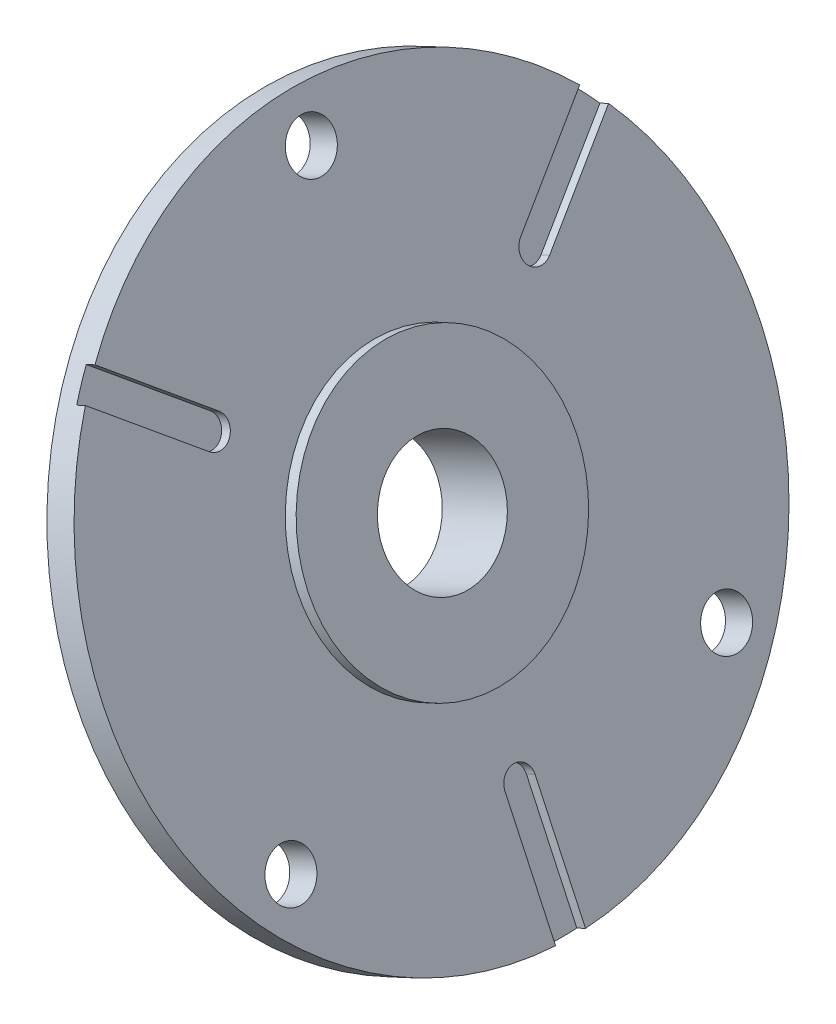
ISO-10303-21;
HEADER;
FILE_DESCRIPTION(('STEP AP214'),'2;1');
FILE_NAME('part.step','',(''),(''),'','','');
FILE_SCHEMA(('AUTOMOTIVE_DESIGN { 1 0 10303 214 1 1 1 1 }'));
ENDSEC;
DATA;
#1=APPLICATION_CONTEXT('core data for automotive mechanical design processes');
#2=APPLICATION_PROTOCOL_DEFINITION('international standard','automotive_design',2000,#1);
#3=PRODUCT_CONTEXT('',#1,'mechanical');
#4=PRODUCT('Part','Part','',(#3));
#5=PRODUCT_RELATED_PRODUCT_CATEGORY('part','',(#4));
#6=PRODUCT_DEFINITION_FORMATION('','',#4);
#7=PRODUCT_DEFINITION_CONTEXT('part definition',#1,'design');
#8=PRODUCT_DEFINITION('design','',#6,#7);
#9=PRODUCT_DEFINITION_SHAPE('','',#8);
#10=(LENGTH_UNIT() NAMED_UNIT(*) SI_UNIT(.MILLI.,.METRE.));
#11=(NAMED_UNIT(*) PLANE_ANGLE_UNIT() SI_UNIT($,.RADIAN.));
#12=(NAMED_UNIT(*) SI_UNIT($,.STERADIAN.) SOLID_ANGLE_UNIT());
#13=UNCERTAINTY_MEASURE_WITH_UNIT(LENGTH_MEASURE(1.E-05),#10,'distance_accuracy_value','');
#14=(GEOMETRIC_REPRESENTATION_CONTEXT(3) GLOBAL_UNCERTAINTY_ASSIGNED_CONTEXT((#13)) GLOBAL_UNIT_ASSIGNED_CONTEXT((#10,
#11,#12)) REPRESENTATION_CONTEXT('',''));
#15=CARTESIAN_POINT('',(0.,0.,0.));
#16=DIRECTION('',(0.,0.,1.));
#17=DIRECTION('',(1.,0.,0.));
#18=AXIS2_PLACEMENT_3D('',#15,#16,#17);
#19=CARTESIAN_POINT('',(0.488501018785264,0.227791766078759,0.));
#20=DIRECTION('',(0.906307787036649,0.422618261740701,0.));
#21=DIRECTION('',(-0.422618261740701,0.906307787036649,0.));
#22=AXIS2_PLACEMENT_3D('',#19,#20,#21);
#23=CYLINDRICAL_SURFACE('',#22,55.);
#24=CARTESIAN_POINT('',(-112.382165592545,-52.4046644558447,0.));
#25=DIRECTION('',(0.906307787036649,0.422618261740701,0.));
#26=DIRECTION('',(-0.422618261740701,0.906307787036649,0.));
#27=AXIS2_PLACEMENT_3D('',#24,#25,#26);
#28=CIRCLE('',#27,55.);
#29=CARTESIAN_POINT('',(-135.626169988284,-2.55773616882898,0.));
#30=VERTEX_POINT('',#29);
#31=EDGE_CURVE('E219',#30,#30,#28,.T.);
#32=ORIENTED_EDGE('',*,*,#31,.T.);
#33=EDGE_LOOP('',(#32));
#34=FACE_BOUND('',#33,.T.);
#35=CARTESIAN_POINT('',(-109.300719116621,-50.9677623659263,0.));
#36=DIRECTION('',(0.906307787036649,0.422618261740701,0.));
#37=DIRECTION('',(-0.422618261740701,0.906307787036649,0.));
#38=AXIS2_PLACEMENT_3D('',#35,#36,#37);
#39=CIRCLE('',#38,55.);
#40=CARTESIAN_POINT('',(-123.416873359484,-20.6955719011254,43.695865638004));
#41=VERTEX_POINT('',#40);
#42=CARTESIAN_POINT('',(-125.03559521432,-17.2242116810508,40.4819275895714));
#43=VERTEX_POINT('',#42);
#44=EDGE_CURVE('E11',#41,#43,#39,.F.);
#45=ORIENTED_EDGE('',*,*,#44,.T.);
#46=DIRECTION('',(0.906307787036649,0.422618261740701,0.));
#47=VECTOR('',#46,1.);
#48=CARTESIAN_POINT('',(-15.2463750789136,33.9713424509542,40.4819275895714));
#49=LINE('',#48,#47);
#50=CARTESIAN_POINT('',(-123.585502755061,-16.5480224622657,40.4819275895714));
#51=VERTEX_POINT('',#50);
#52=EDGE_CURVE('E191',#43,#51,#49,.T.);
#53=ORIENTED_EDGE('',*,*,#52,.T.);
#54=CARTESIAN_POINT('',(-107.850626657362,-50.2915731471412,0.));
#55=DIRECTION('',(0.906307787036649,0.422618261740701,0.));
#56=DIRECTION('',(-0.422618261740701,0.906307787036649,0.));
#57=AXIS2_PLACEMENT_3D('',#54,#55,#56);
#58=CIRCLE('',#57,55.);
#59=CARTESIAN_POINT('',(-123.585502755061,-16.5480224622657,-40.4819275895714));
#60=VERTEX_POINT('',#59);
#61=EDGE_CURVE('E214',#60,#51,#58,.T.);
#62=ORIENTED_EDGE('',*,*,#61,.F.);
#63=DIRECTION('',(0.906307787036649,0.422618261740701,0.));
#64=VECTOR('',#63,1.);
#65=CARTESIAN_POINT('',(-15.2463750789136,33.9713424509542,-40.4819275895714));
#66=LINE('',#65,#64);
#67=CARTESIAN_POINT('',(-125.03559521432,-17.2242116810508,-40.4819275895714));
#68=VERTEX_POINT('',#67);
#69=EDGE_CURVE('E187',#68,#60,#66,.T.);
#70=ORIENTED_EDGE('',*,*,#69,.F.);
#71=CARTESIAN_POINT('',(-109.300719116621,-50.9677623659263,0.));
#72=DIRECTION('',(0.906307787036649,0.422618261740701,0.));
#73=DIRECTION('',(-0.422618261740701,0.906307787036649,0.));
#74=AXIS2_PLACEMENT_3D('',#71,#72,#73);
#75=CIRCLE('',#74,55.);
#76=CARTESIAN_POINT('',(-123.416873359484,-20.6955719011253,-43.695865638004));
#77=VERTEX_POINT('',#76);
#78=EDGE_CURVE('E41',#68,#77,#75,.F.);
#79=ORIENTED_EDGE('',*,*,#78,.T.);
#80=DIRECTION('',(0.906307787036649,0.422618261740701,0.));
#81=VECTOR('',#80,1.);
#82=CARTESIAN_POINT('',(-13.6276532240782,30.4999822308798,-43.695865638004));
#83=LINE('',#82,#81);
#84=CARTESIAN_POINT('',(-121.966780900226,-20.0193826823402,-43.695865638004));
#85=VERTEX_POINT('',#84);
#86=EDGE_CURVE('E184',#77,#85,#83,.T.);
#87=ORIENTED_EDGE('',*,*,#86,.T.);
#88=CARTESIAN_POINT('',(-84.6306470787884,-100.086980047483,-2.50000000000001));
#89=VERTEX_POINT('',#88);
#90=EDGE_CURVE('E217',#89,#85,#58,.T.);
#91=ORIENTED_EDGE('',*,*,#90,.F.);
#92=DIRECTION('',(0.906307787036649,0.422618261740701,0.));
#93=VECTOR('',#92,1.);
#94=CARTESIAN_POINT('',(23.708480597359,-49.5676151342631,-2.50000000000001));
#95=LINE('',#94,#93);
#96=CARTESIAN_POINT('',(-86.0807395380471,-100.763169266268,-2.50000000000001));
#97=VERTEX_POINT('',#96);
#98=EDGE_CURVE('E56',#97,#89,#95,.T.);
#99=ORIENTED_EDGE('',*,*,#98,.F.);
#100=CARTESIAN_POINT('',(-109.300719116621,-50.9677623659263,0.));
#101=DIRECTION('',(0.906307787036649,0.422618261740701,0.));
#102=DIRECTION('',(-0.422618261740701,0.906307787036649,0.));
#103=AXIS2_PLACEMENT_3D('',#100,#101,#102);
#104=CIRCLE('',#103,55.);
#105=CARTESIAN_POINT('',(-86.0807395380471,-100.763169266268,2.49999999999999));
#106=VERTEX_POINT('',#105);
#107=EDGE_CURVE('E252',#97,#106,#104,.F.);
#108=ORIENTED_EDGE('',*,*,#107,.T.);
#109=DIRECTION('',(0.906307787036649,0.422618261740701,0.));
#110=VECTOR('',#109,1.);
#111=CARTESIAN_POINT('',(23.708480597359,-49.5676151342631,2.49999999999999));
#112=LINE('',#111,#110);
#113=CARTESIAN_POINT('',(-84.6306470787884,-100.086980047483,2.49999999999999));
#114=VERTEX_POINT('',#113);
#115=EDGE_CURVE('E181',#106,#114,#112,.T.);
#116=ORIENTED_EDGE('',*,*,#115,.T.);
#117=CARTESIAN_POINT('',(-121.966780900226,-20.0193826823402,43.695865638004));
#118=VERTEX_POINT('',#117);
#119=EDGE_CURVE('E218',#118,#114,#58,.T.);
#120=ORIENTED_EDGE('',*,*,#119,.F.);
#121=DIRECTION('',(0.906307787036649,0.422618261740701,0.));
#122=VECTOR('',#121,1.);
#123=CARTESIAN_POINT('',(-13.6276532240782,30.4999822308797,43.695865638004));
#124=LINE('',#123,#122);
#125=EDGE_CURVE('E189',#41,#118,#124,.T.);
#126=ORIENTED_EDGE('',*,*,#125,.F.);
#127=EDGE_LOOP('',(#45,#53,#62,#70,#79,#87,#91,#99,#108,#116,#120,#126));
#128=FACE_BOUND('',#127,.T.);
#129=ADVANCED_FACE('F33',(#34,#128),#23,.T.);
#130=CARTESIAN_POINT('',(-131.094631053101,-0.444644860125507,0.));
#131=DIRECTION('',(0.906307787036649,0.422618261740701,0.));
#132=DIRECTION('',(-0.422618261740701,0.906307787036649,0.));
#133=AXIS2_PLACEMENT_3D('',#130,#131,#132);
#134=PLANE('',#133);
#135=CARTESIAN_POINT('',(-94.9470719993373,-77.9633354104488,-36.3871110481513));
#136=DIRECTION('',(0.906307787036649,0.422618261740701,0.));
#137=DIRECTION('',(-0.422618261740701,0.906307787036649,0.));
#138=AXIS2_PLACEMENT_3D('',#135,#136,#137);
#139=CIRCLE('',#138,4.);
#140=CARTESIAN_POINT('',(-96.6375450463001,-74.3381042623022,-36.3871110481513));
#141=VERTEX_POINT('',#140);
#142=EDGE_CURVE('E208',#141,#141,#139,.T.);
#143=ORIENTED_EDGE('',*,*,#142,.F.);
#144=EDGE_LOOP('',(#143));
#145=FACE_BOUND('',#144,.T.);
#146=CARTESIAN_POINT('',(-94.9470719993373,-77.9633354104488,36.3871110481513));
#147=DIRECTION('',(0.906307787036649,0.422618261740701,0.));
#148=DIRECTION('',(-0.422618261740701,0.906307787036649,0.));
#149=AXIS2_PLACEMENT_3D('',#146,#147,#148);
#150=CIRCLE('',#149,4.);
#151=CARTESIAN_POINT('',(-96.6375450463001,-74.3381042623022,36.3871110481513));
#152=VERTEX_POINT('',#151);
#153=EDGE_CURVE('E234',#152,#152,#150,.T.);
#154=ORIENTED_EDGE('',*,*,#153,.F.);
#155=EDGE_LOOP('',(#154));
#156=FACE_BOUND('',#155,.T.);
#157=CARTESIAN_POINT('',(-127.924994090045,-7.24195326290257,0.));
#158=DIRECTION('',(0.906307787036649,0.422618261740701,0.));
#159=DIRECTION('',(-0.422618261740701,0.906307787036649,0.));
#160=AXIS2_PLACEMENT_3D('',#157,#158,#159);
#161=CIRCLE('',#160,4.);
#162=CARTESIAN_POINT('',(-129.615467137007,-3.61672211475597,0.));
#163=VERTEX_POINT('',#162);
#164=EDGE_CURVE('E203',#163,#163,#161,.T.);
#165=ORIENTED_EDGE('',*,*,#164,.F.);
#166=EDGE_LOOP('',(#165));
#167=FACE_BOUND('',#166,.T.);
#168=CARTESIAN_POINT('',(-107.850626657362,-50.2915731471412,0.));
#169=DIRECTION('',(0.906307787036649,0.422618261740701,0.));
#170=DIRECTION('',(-0.422618261740701,0.906307787036649,0.));
#171=AXIS2_PLACEMENT_3D('',#168,#169,#170);
#172=CIRCLE('',#171,22.5);
#173=CARTESIAN_POINT('',(-117.359537546528,-29.8996479388166,0.));
#174=VERTEX_POINT('',#173);
#175=EDGE_CURVE('E211',#174,#174,#172,.T.);
#176=ORIENTED_EDGE('',*,*,#175,.F.);
#177=EDGE_LOOP('',(#176));
#178=FACE_BOUND('',#177,.T.);
#179=ORIENTED_EDGE('',*,*,#61,.T.);
#180=DIRECTION('',(0.271653782274187,-0.582563416069588,-0.766044443118975));
#181=VECTOR('',#180,1.);
#182=CARTESIAN_POINT('',(-118.263850280148,-27.9603430232644,25.4752441836206));
#183=LINE('',#182,#181);
#184=CARTESIAN_POINT('',(-118.167869964376,-28.1661734746697,25.204586484949));
#185=VERTEX_POINT('',#184);
#186=EDGE_CURVE('E249',#51,#185,#183,.T.);
#187=ORIENTED_EDGE('',*,*,#186,.T.);
#188=CARTESIAN_POINT('',(-117.358509036958,-29.9018535847069,26.8115555091653));
#189=DIRECTION('',(0.906307787036649,0.422618261740701,0.));
#190=DIRECTION('',(-0.422618261740701,0.906307787036649,0.));
#191=AXIS2_PLACEMENT_3D('',#188,#189,#190);
#192=CIRCLE('',#191,2.5);
#193=CARTESIAN_POINT('',(-116.54914810954,-31.6375336947441,28.4185245333817));
#194=VERTEX_POINT('',#193);
#195=EDGE_CURVE('E150',#194,#185,#192,.T.);
#196=ORIENTED_EDGE('',*,*,#195,.F.);
#197=DIRECTION('',(0.271653782274187,-0.582563416069588,-0.766044443118975));
#198=VECTOR('',#197,1.);
#199=CARTESIAN_POINT('',(-116.645128425312,-31.4317032433389,28.6891822320533));
#200=LINE('',#199,#198);
#201=EDGE_CURVE('E139',#118,#194,#200,.T.);
#202=ORIENTED_EDGE('',*,*,#201,.F.);
#203=ORIENTED_EDGE('',*,*,#119,.T.);
#204=DIRECTION('',(-0.422618261740701,0.906307787036649,0.));
#205=VECTOR('',#204,1.);
#206=CARTESIAN_POINT('',(-131.094631053101,-0.444644860125507,2.50000000000002));
#207=LINE('',#206,#205);
#208=CARTESIAN_POINT('',(-93.0589874964377,-82.0123456934239,2.5));
#209=VERTEX_POINT('',#208);
#210=EDGE_CURVE('E240',#114,#209,#207,.T.);
#211=ORIENTED_EDGE('',*,*,#210,.T.);
#212=CARTESIAN_POINT('',(-93.0589874964377,-82.0123456934239,0.));
#213=DIRECTION('',(0.906307787036649,0.422618261740701,0.));
#214=DIRECTION('',(-0.422618261740701,0.906307787036649,0.));
#215=AXIS2_PLACEMENT_3D('',#212,#213,#214);
#216=CIRCLE('',#215,2.5);
#217=CARTESIAN_POINT('',(-93.0589874964377,-82.0123456934239,-2.5));
#218=VERTEX_POINT('',#217);
#219=EDGE_CURVE('E169',#218,#209,#216,.T.);
#220=ORIENTED_EDGE('',*,*,#219,.F.);
#221=DIRECTION('',(-0.422618261740701,0.906307787036649,0.));
#222=VECTOR('',#221,1.);
#223=CARTESIAN_POINT('',(-131.094631053101,-0.444644860125506,-2.49999999999998));
#224=LINE('',#223,#222);
#225=EDGE_CURVE('E231',#89,#218,#224,.T.);
#226=ORIENTED_EDGE('',*,*,#225,.F.);
#227=ORIENTED_EDGE('',*,*,#90,.T.);
#228=DIRECTION('',(0.271653782274187,-0.582563416069588,0.766044443118975));
#229=VECTOR('',#228,1.);
#230=CARTESIAN_POINT('',(-116.645128425312,-31.4317032433388,-28.6891822320533));
#231=LINE('',#230,#229);
#232=CARTESIAN_POINT('',(-116.54914810954,-31.6375336947441,-28.4185245333817));
#233=VERTEX_POINT('',#232);
#234=EDGE_CURVE('E243',#85,#233,#231,.T.);
#235=ORIENTED_EDGE('',*,*,#234,.T.);
#236=CARTESIAN_POINT('',(-117.358509036958,-29.9018535847069,-26.8115555091653));
#237=DIRECTION('',(0.906307787036649,0.422618261740701,0.));
#238=DIRECTION('',(-0.422618261740701,0.906307787036649,0.));
#239=AXIS2_PLACEMENT_3D('',#236,#237,#238);
#240=CIRCLE('',#239,2.49999999999999);
#241=CARTESIAN_POINT('',(-118.167869964376,-28.1661734746697,-25.2045864849489));
#242=VERTEX_POINT('',#241);
#243=EDGE_CURVE('E157',#242,#233,#240,.T.);
#244=ORIENTED_EDGE('',*,*,#243,.F.);
#245=DIRECTION('',(0.271653782274187,-0.582563416069589,0.766044443118975));
#246=VECTOR('',#245,1.);
#247=CARTESIAN_POINT('',(-118.263850280148,-27.9603430232644,-25.4752441836206));
#248=LINE('',#247,#246);
#249=EDGE_CURVE('E246',#60,#242,#248,.T.);
#250=ORIENTED_EDGE('',*,*,#249,.F.);
#251=EDGE_LOOP('',(#179,#187,#196,#202,#203,#211,#220,#226,#227,#235,#244,#250));
#252=FACE_BOUND('',#251,.T.);
#253=ADVANCED_FACE('F273',(#145,#156,#167,#178,#252),#134,.T.);
#254=CARTESIAN_POINT('',(0.488501018785264,0.227791766078759,0.));
#255=DIRECTION('',(0.906307787036649,0.422618261740701,0.));
#256=DIRECTION('',(-0.422618261740701,0.906307787036649,0.));
#257=AXIS2_PLACEMENT_3D('',#254,#255,#256);
#258=CYLINDRICAL_SURFACE('',#257,9.99999999999757);
#259=CARTESIAN_POINT('',(-106.038011083289,-49.4463366236598,0.));
#260=DIRECTION('',(0.906307787036649,0.422618261740701,0.));
#261=DIRECTION('',(-0.422618261740701,0.906307787036649,0.));
#262=AXIS2_PLACEMENT_3D('',#259,#260,#261);
#263=CIRCLE('',#262,9.99999999999757);
#264=CARTESIAN_POINT('',(-110.264193700695,-40.3832587532955,0.));
#265=VERTEX_POINT('',#264);
#266=EDGE_CURVE('E204',#265,#265,#263,.T.);
#267=ORIENTED_EDGE('',*,*,#266,.T.);
#268=EDGE_LOOP('',(#267));
#269=FACE_BOUND('',#268,.T.);
#270=CARTESIAN_POINT('',(-116.913704527729,-54.5177557645483,0.));
#271=DIRECTION('',(0.906307787036649,0.422618261740701,0.));
#272=DIRECTION('',(-0.422618261740701,0.906307787036649,0.));
#273=AXIS2_PLACEMENT_3D('',#270,#271,#272);
#274=CIRCLE('',#273,9.99999999999757);
#275=CARTESIAN_POINT('',(-121.139887145135,-45.454677894184,0.));
#276=VERTEX_POINT('',#275);
#277=EDGE_CURVE('E228',#276,#276,#274,.T.);
#278=ORIENTED_EDGE('',*,*,#277,.F.);
#279=EDGE_LOOP('',(#278));
#280=FACE_BOUND('',#279,.T.);
#281=ADVANCED_FACE('F35',(#269,#280),#258,.F.);
#282=CARTESIAN_POINT('',(-121.139887145135,-45.454677894184,0.));
#283=DIRECTION('',(-0.906307787036649,-0.422618261740701,0.));
#284=DIRECTION('',(0.422618261740701,-0.906307787036649,0.));
#285=AXIS2_PLACEMENT_3D('',#282,#283,#284);
#286=PLANE('',#285);
#287=ORIENTED_EDGE('',*,*,#277,.T.);
#288=EDGE_LOOP('',(#287));
#289=FACE_BOUND('',#288,.T.);
#290=CARTESIAN_POINT('',(-116.913704527729,-54.5177557645482,0.));
#291=DIRECTION('',(0.906307787036649,0.422618261740701,0.));
#292=DIRECTION('',(-0.422618261740701,0.906307787036649,0.));
#293=AXIS2_PLACEMENT_3D('',#290,#291,#292);
#294=CIRCLE('',#293,14.9999999999976);
#295=CARTESIAN_POINT('',(-123.252978453838,-40.9231389590007,0.));
#296=VERTEX_POINT('',#295);
#297=EDGE_CURVE('E225',#296,#296,#294,.T.);
#298=ORIENTED_EDGE('',*,*,#297,.F.);
#299=EDGE_LOOP('',(#298));
#300=FACE_BOUND('',#299,.T.);
#301=ADVANCED_FACE('F314',(#289,#300),#286,.T.);
#302=CARTESIAN_POINT('',(0.488501018785264,0.227791766078759,0.));
#303=DIRECTION('',(0.906307787036649,0.422618261740701,0.));
#304=DIRECTION('',(-0.422618261740701,0.906307787036649,0.));
#305=AXIS2_PLACEMENT_3D('',#302,#303,#304);
#306=CYLINDRICAL_SURFACE('',#305,14.9999999999976);
#307=ORIENTED_EDGE('',*,*,#297,.T.);
#308=EDGE_LOOP('',(#307));
#309=FACE_BOUND('',#308,.T.);
#310=CARTESIAN_POINT('',(-112.382165592546,-52.4046644558447,0.));
#311=DIRECTION('',(0.906307787036649,0.422618261740701,0.));
#312=DIRECTION('',(-0.422618261740701,0.906307787036649,0.));
#313=AXIS2_PLACEMENT_3D('',#310,#311,#312);
#314=CIRCLE('',#313,14.9999999999976);
#315=CARTESIAN_POINT('',(-118.721439518655,-38.8100476502972,0.));
#316=VERTEX_POINT('',#315);
#317=EDGE_CURVE('E222',#316,#316,#314,.T.);
#318=ORIENTED_EDGE('',*,*,#317,.F.);
#319=EDGE_LOOP('',(#318));
#320=FACE_BOUND('',#319,.T.);
#321=ADVANCED_FACE('F311',(#309,#320),#306,.T.);
#322=CARTESIAN_POINT('',(-118.721439518655,-38.8100476502972,0.));
#323=DIRECTION('',(-0.906307787036649,-0.422618261740701,0.));
#324=DIRECTION('',(0.422618261740701,-0.906307787036649,0.));
#325=AXIS2_PLACEMENT_3D('',#322,#323,#324);
#326=PLANE('',#325);
#327=CARTESIAN_POINT('',(-99.4786109345206,-80.0764267191523,-36.3871110481513));
#328=DIRECTION('',(-0.906307787036649,-0.422618261740701,0.));
#329=DIRECTION('',(0.422618261740701,-0.906307787036649,0.));
#330=AXIS2_PLACEMENT_3D('',#327,#328,#329);
#331=CIRCLE('',#330,4.);
#332=CARTESIAN_POINT('',(-97.7881378875578,-83.7016578672989,-36.3871110481513));
#333=VERTEX_POINT('',#332);
#334=EDGE_CURVE('E194',#333,#333,#331,.T.);
#335=ORIENTED_EDGE('',*,*,#334,.F.);
#336=EDGE_LOOP('',(#335));
#337=FACE_BOUND('',#336,.T.);
#338=CARTESIAN_POINT('',(-99.4786109345205,-80.0764267191523,36.3871110481513));
#339=DIRECTION('',(-0.906307787036649,-0.422618261740701,0.));
#340=DIRECTION('',(0.422618261740701,-0.906307787036649,0.));
#341=AXIS2_PLACEMENT_3D('',#338,#339,#340);
#342=CIRCLE('',#341,4.);
#343=CARTESIAN_POINT('',(-97.7881378875577,-83.7016578672989,36.3871110481513));
#344=VERTEX_POINT('',#343);
#345=EDGE_CURVE('E195',#344,#344,#342,.T.);
#346=ORIENTED_EDGE('',*,*,#345,.F.);
#347=EDGE_LOOP('',(#346));
#348=FACE_BOUND('',#347,.T.);
#349=CARTESIAN_POINT('',(-132.456533025228,-9.35504457160606,0.));
#350=DIRECTION('',(-0.906307787036649,-0.422618261740701,0.));
#351=DIRECTION('',(0.422618261740701,-0.906307787036649,0.));
#352=AXIS2_PLACEMENT_3D('',#349,#350,#351);
#353=CIRCLE('',#352,4.);
#354=CARTESIAN_POINT('',(-130.766059978265,-12.9802757197527,0.));
#355=VERTEX_POINT('',#354);
#356=EDGE_CURVE('E198',#355,#355,#353,.T.);
#357=ORIENTED_EDGE('',*,*,#356,.F.);
#358=EDGE_LOOP('',(#357));
#359=FACE_BOUND('',#358,.T.);
#360=ORIENTED_EDGE('',*,*,#317,.T.);
#361=EDGE_LOOP('',(#360));
#362=FACE_BOUND('',#361,.T.);
#363=ORIENTED_EDGE('',*,*,#31,.F.);
#364=EDGE_LOOP('',(#363));
#365=FACE_BOUND('',#364,.T.);
#366=ADVANCED_FACE('F307',(#337,#348,#359,#362,#365),#326,.T.);
#367=CARTESIAN_POINT('',(0.488501018785264,0.227791766078759,0.));
#368=DIRECTION('',(0.906307787036649,0.422618261740701,0.));
#369=DIRECTION('',(-0.422618261740701,0.906307787036649,0.));
#370=AXIS2_PLACEMENT_3D('',#367,#368,#369);
#371=CYLINDRICAL_SURFACE('',#370,22.5);
#372=ORIENTED_EDGE('',*,*,#175,.T.);
#373=EDGE_LOOP('',(#372));
#374=FACE_BOUND('',#373,.T.);
#375=CARTESIAN_POINT('',(-106.038011083289,-49.4463366236598,0.));
#376=DIRECTION('',(0.906307787036649,0.422618261740701,0.));
#377=DIRECTION('',(-0.422618261740701,0.906307787036649,0.));
#378=AXIS2_PLACEMENT_3D('',#375,#376,#377);
#379=CIRCLE('',#378,22.5);
#380=CARTESIAN_POINT('',(-115.546921972455,-29.0544114153352,0.));
#381=VERTEX_POINT('',#380);
#382=EDGE_CURVE('E207',#381,#381,#379,.T.);
#383=ORIENTED_EDGE('',*,*,#382,.F.);
#384=EDGE_LOOP('',(#383));
#385=FACE_BOUND('',#384,.T.);
#386=ADVANCED_FACE('F310',(#374,#385),#371,.T.);
#387=CARTESIAN_POINT('',(-115.546921972455,-29.0544114153352,0.));
#388=DIRECTION('',(0.906307787036649,0.422618261740701,0.));
#389=DIRECTION('',(-0.422618261740701,0.906307787036649,0.));
#390=AXIS2_PLACEMENT_3D('',#387,#388,#389);
#391=PLANE('',#390);
#392=ORIENTED_EDGE('',*,*,#382,.T.);
#393=EDGE_LOOP('',(#392));
#394=FACE_BOUND('',#393,.T.);
#395=ORIENTED_EDGE('',*,*,#266,.F.);
#396=EDGE_LOOP('',(#395));
#397=FACE_BOUND('',#396,.T.);
#398=ADVANCED_FACE('F335',(#394,#397),#391,.T.);
#399=CARTESIAN_POINT('',(45.8268268838723,73.7798514756115,0.));
#400=DIRECTION('',(-0.906307787036649,-0.422618261740701,0.));
#401=DIRECTION('',(0.422618261740701,-0.906307787036649,0.));
#402=AXIS2_PLACEMENT_3D('',#399,#400,#401);
#403=CYLINDRICAL_SURFACE('',#402,4.);
#404=ORIENTED_EDGE('',*,*,#164,.T.);
#405=EDGE_LOOP('',(#404));
#406=FACE_BOUND('',#405,.T.);
#407=ORIENTED_EDGE('',*,*,#356,.T.);
#408=EDGE_LOOP('',(#407));
#409=FACE_BOUND('',#408,.T.);
#410=ADVANCED_FACE('F337',(#406,#409),#403,.F.);
#411=CARTESIAN_POINT('',(78.8047489745795,3.05846932806522,36.3871110481513));
#412=DIRECTION('',(-0.906307787036649,-0.422618261740701,0.));
#413=DIRECTION('',(0.422618261740701,-0.906307787036649,0.));
#414=AXIS2_PLACEMENT_3D('',#411,#412,#413);
#415=CYLINDRICAL_SURFACE('',#414,4.);
#416=ORIENTED_EDGE('',*,*,#153,.T.);
#417=EDGE_LOOP('',(#416));
#418=FACE_BOUND('',#417,.T.);
#419=ORIENTED_EDGE('',*,*,#345,.T.);
#420=EDGE_LOOP('',(#419));
#421=FACE_BOUND('',#420,.T.);
#422=ADVANCED_FACE('F344',(#418,#421),#415,.F.);
#423=CARTESIAN_POINT('',(78.8047489745795,3.05846932806524,-36.3871110481513));
#424=DIRECTION('',(-0.906307787036649,-0.422618261740701,0.));
#425=DIRECTION('',(0.422618261740701,-0.906307787036649,0.));
#426=AXIS2_PLACEMENT_3D('',#423,#424,#425);
#427=CYLINDRICAL_SURFACE('',#426,4.);
#428=ORIENTED_EDGE('',*,*,#142,.T.);
#429=EDGE_LOOP('',(#428));
#430=FACE_BOUND('',#429,.T.);
#431=ORIENTED_EDGE('',*,*,#334,.T.);
#432=EDGE_LOOP('',(#431));
#433=FACE_BOUND('',#432,.T.);
#434=ADVANCED_FACE('F349',(#430,#433),#427,.F.);
#435=CARTESIAN_POINT('',(-109.30071911662,-50.9677623659285,2.50000000000001));
#436=DIRECTION('',(0.,0.,-1.));
#437=DIRECTION('',(0.,1.,0.));
#438=AXIS2_PLACEMENT_3D('',#435,#436,#437);
#439=PLANE('',#438);
#440=DIRECTION('',(-0.422618261740701,0.906307787036649,0.));
#441=VECTOR('',#440,1.);
#442=CARTESIAN_POINT('',(-109.30071911662,-50.9677623659285,2.50000000000001));
#443=LINE('',#442,#441);
#444=CARTESIAN_POINT('',(-94.5090799556964,-82.688534912209,2.5));
#445=VERTEX_POINT('',#444);
#446=EDGE_CURVE('E166',#106,#445,#443,.T.);
#447=ORIENTED_EDGE('',*,*,#446,.T.);
#448=DIRECTION('',(0.906307787036649,0.422618261740701,0.));
#449=VECTOR('',#448,1.);
#450=CARTESIAN_POINT('',(-94.5090799556964,-82.688534912209,2.5));
#451=LINE('',#450,#449);
#452=EDGE_CURVE('E163',#445,#209,#451,.T.);
#453=ORIENTED_EDGE('',*,*,#452,.T.);
#454=ORIENTED_EDGE('',*,*,#210,.F.);
#455=ORIENTED_EDGE('',*,*,#115,.F.);
#456=EDGE_LOOP('',(#447,#453,#454,#455));
#457=FACE_BOUND('',#456,.T.);
#458=ADVANCED_FACE('F279',(#457),#439,.T.);
#459=CARTESIAN_POINT('',(-94.5090799556964,-82.688534912209,0.));
#460=DIRECTION('',(0.906307787036649,0.422618261740701,0.));
#461=DIRECTION('',(-0.422618261740701,0.906307787036649,0.));
#462=AXIS2_PLACEMENT_3D('',#459,#460,#461);
#463=CYLINDRICAL_SURFACE('',#462,2.5);
#464=ORIENTED_EDGE('',*,*,#219,.T.);
#465=ORIENTED_EDGE('',*,*,#452,.F.);
#466=CARTESIAN_POINT('',(-94.5090799556964,-82.688534912209,0.));
#467=DIRECTION('',(0.906307787036649,0.422618261740701,0.));
#468=DIRECTION('',(-0.422618261740701,0.906307787036649,0.));
#469=AXIS2_PLACEMENT_3D('',#466,#467,#468);
#470=CIRCLE('',#469,2.5);
#471=CARTESIAN_POINT('',(-94.5090799556964,-82.688534912209,-2.5));
#472=VERTEX_POINT('',#471);
#473=EDGE_CURVE('E171',#472,#445,#470,.T.);
#474=ORIENTED_EDGE('',*,*,#473,.F.);
#475=DIRECTION('',(0.906307787036649,0.422618261740701,0.));
#476=VECTOR('',#475,1.);
#477=CARTESIAN_POINT('',(-94.5090799556964,-82.688534912209,-2.5));
#478=LINE('',#477,#476);
#479=EDGE_CURVE('E174',#472,#218,#478,.T.);
#480=ORIENTED_EDGE('',*,*,#479,.T.);
#481=EDGE_LOOP('',(#464,#465,#474,#480));
#482=FACE_BOUND('',#481,.T.);
#483=ADVANCED_FACE('F286',(#482),#463,.F.);
#484=CARTESIAN_POINT('',(-109.30071911662,-50.9677623659285,-2.49999999999999));
#485=DIRECTION('',(0.,0.,-1.));
#486=DIRECTION('',(0.,1.,0.));
#487=AXIS2_PLACEMENT_3D('',#484,#485,#486);
#488=PLANE('',#487);
#489=ORIENTED_EDGE('',*,*,#98,.T.);
#490=ORIENTED_EDGE('',*,*,#225,.T.);
#491=ORIENTED_EDGE('',*,*,#479,.F.);
#492=DIRECTION('',(-0.422618261740701,0.906307787036649,0.));
#493=VECTOR('',#492,1.);
#494=CARTESIAN_POINT('',(-109.30071911662,-50.9677623659285,-2.49999999999999));
#495=LINE('',#494,#493);
#496=EDGE_CURVE('E168',#97,#472,#495,.T.);
#497=ORIENTED_EDGE('',*,*,#496,.F.);
#498=EDGE_LOOP('',(#489,#490,#491,#497));
#499=FACE_BOUND('',#498,.T.);
#500=ADVANCED_FACE('F287',(#499),#488,.F.);
#501=CARTESIAN_POINT('',(-109.30071911662,-50.9677623659285,0.));
#502=DIRECTION('',(0.906307787036649,0.422618261740701,0.));
#503=DIRECTION('',(-0.422618261740701,0.906307787036649,0.));
#504=AXIS2_PLACEMENT_3D('',#501,#502,#503);
#505=PLANE('',#504);
#506=ORIENTED_EDGE('',*,*,#496,.T.);
#507=ORIENTED_EDGE('',*,*,#473,.T.);
#508=ORIENTED_EDGE('',*,*,#446,.F.);
#509=ORIENTED_EDGE('',*,*,#107,.F.);
#510=EDGE_LOOP('',(#506,#507,#508,#509));
#511=FACE_BOUND('',#510,.T.);
#512=ADVANCED_FACE('F282',(#511),#505,.T.);
#513=CARTESIAN_POINT('',(-110.110080044037,-49.2320822558913,1.60696902421633));
#514=DIRECTION('',(-0.323744370967064,0.69427204401488,0.642787609686543));
#515=DIRECTION('',(0.,-0.679375665757998,0.733790640970486));
#516=AXIS2_PLACEMENT_3D('',#513,#514,#515);
#517=PLANE('',#516);
#518=ORIENTED_EDGE('',*,*,#69,.T.);
#519=ORIENTED_EDGE('',*,*,#249,.T.);
#520=DIRECTION('',(0.906307787036649,0.422618261740701,0.));
#521=VECTOR('',#520,1.);
#522=CARTESIAN_POINT('',(-119.617962423634,-28.8423626934549,-25.204586484949));
#523=LINE('',#522,#521);
#524=CARTESIAN_POINT('',(-119.617962423634,-28.8423626934549,-25.204586484949));
#525=VERTEX_POINT('',#524);
#526=EDGE_CURVE('E48',#525,#242,#523,.T.);
#527=ORIENTED_EDGE('',*,*,#526,.F.);
#528=DIRECTION('',(0.271653782274187,-0.582563416069589,0.766044443118975));
#529=VECTOR('',#528,1.);
#530=CARTESIAN_POINT('',(-110.110080044037,-49.2320822558913,1.60696902421633));
#531=LINE('',#530,#529);
#532=EDGE_CURVE('E154',#68,#525,#531,.T.);
#533=ORIENTED_EDGE('',*,*,#532,.F.);
#534=EDGE_LOOP('',(#518,#519,#527,#533));
#535=FACE_BOUND('',#534,.T.);
#536=ADVANCED_FACE('F265',(#535),#517,.F.);
#537=CARTESIAN_POINT('',(-108.491358189202,-52.7034424759657,-1.60696902421637));
#538=DIRECTION('',(-0.323744370967065,0.69427204401488,0.642787609686543));
#539=DIRECTION('',(0.,-0.679375665757998,0.733790640970487));
#540=AXIS2_PLACEMENT_3D('',#537,#538,#539);
#541=PLANE('',#540);
#542=DIRECTION('',(0.271653782274187,-0.582563416069588,0.766044443118975));
#543=VECTOR('',#542,1.);
#544=CARTESIAN_POINT('',(-108.491358189202,-52.7034424759657,-1.60696902421637));
#545=LINE('',#544,#543);
#546=CARTESIAN_POINT('',(-117.999240568799,-32.3137229135292,-28.4185245333817));
#547=VERTEX_POINT('',#546);
#548=EDGE_CURVE('E160',#77,#547,#545,.T.);
#549=ORIENTED_EDGE('',*,*,#548,.T.);
#550=DIRECTION('',(0.906307787036649,0.422618261740701,0.));
#551=VECTOR('',#550,1.);
#552=CARTESIAN_POINT('',(-117.999240568799,-32.3137229135292,-28.4185245333817));
#553=LINE('',#552,#551);
#554=EDGE_CURVE('E152',#547,#233,#553,.T.);
#555=ORIENTED_EDGE('',*,*,#554,.T.);
#556=ORIENTED_EDGE('',*,*,#234,.F.);
#557=ORIENTED_EDGE('',*,*,#86,.F.);
#558=EDGE_LOOP('',(#549,#555,#556,#557));
#559=FACE_BOUND('',#558,.T.);
#560=ADVANCED_FACE('F271',(#559),#541,.T.);
#561=CARTESIAN_POINT('',(-118.808601496217,-30.578042803492,-26.8115555091653));
#562=DIRECTION('',(0.906307787036649,0.422618261740701,0.));
#563=DIRECTION('',(-0.422618261740701,0.906307787036649,0.));
#564=AXIS2_PLACEMENT_3D('',#561,#562,#563);
#565=CYLINDRICAL_SURFACE('',#564,2.49999999999999);
#566=ORIENTED_EDGE('',*,*,#243,.T.);
#567=ORIENTED_EDGE('',*,*,#554,.F.);
#568=CARTESIAN_POINT('',(-118.808601496217,-30.578042803492,-26.8115555091653));
#569=DIRECTION('',(0.906307787036649,0.422618261740701,0.));
#570=DIRECTION('',(-0.422618261740701,0.906307787036649,0.));
#571=AXIS2_PLACEMENT_3D('',#568,#569,#570);
#572=CIRCLE('',#571,2.49999999999999);
#573=EDGE_CURVE('E156',#525,#547,#572,.T.);
#574=ORIENTED_EDGE('',*,*,#573,.F.);
#575=ORIENTED_EDGE('',*,*,#526,.T.);
#576=EDGE_LOOP('',(#566,#567,#574,#575));
#577=FACE_BOUND('',#576,.T.);
#578=ADVANCED_FACE('F269',(#577),#565,.F.);
#579=CARTESIAN_POINT('',(-109.30071911662,-50.9677623659285,0.));
#580=DIRECTION('',(0.906307787036649,0.422618261740701,0.));
#581=DIRECTION('',(-0.422618261740701,0.906307787036649,0.));
#582=AXIS2_PLACEMENT_3D('',#579,#580,#581);
#583=PLANE('',#582);
#584=ORIENTED_EDGE('',*,*,#532,.T.);
#585=ORIENTED_EDGE('',*,*,#573,.T.);
#586=ORIENTED_EDGE('',*,*,#548,.F.);
#587=ORIENTED_EDGE('',*,*,#78,.F.);
#588=EDGE_LOOP('',(#584,#585,#586,#587));
#589=FACE_BOUND('',#588,.T.);
#590=ADVANCED_FACE('F263',(#589),#583,.T.);
#591=CARTESIAN_POINT('',(-110.110080044038,-49.2320822558913,-1.60696902421637));
#592=DIRECTION('',(0.323744370967065,-0.694272044014881,0.642787609686543));
#593=DIRECTION('',(0.,-0.679375665757997,-0.733790640970487));
#594=AXIS2_PLACEMENT_3D('',#591,#592,#593);
#595=PLANE('',#594);
#596=DIRECTION('',(0.271653782274187,-0.582563416069588,-0.766044443118975));
#597=VECTOR('',#596,1.);
#598=CARTESIAN_POINT('',(-110.110080044038,-49.2320822558913,-1.60696902421637));
#599=LINE('',#598,#597);
#600=CARTESIAN_POINT('',(-119.617962423634,-28.8423626934548,25.204586484949));
#601=VERTEX_POINT('',#600);
#602=EDGE_CURVE('E133',#43,#601,#599,.T.);
#603=ORIENTED_EDGE('',*,*,#602,.T.);
#604=DIRECTION('',(0.906307787036649,0.422618261740701,0.));
#605=VECTOR('',#604,1.);
#606=CARTESIAN_POINT('',(-119.617962423634,-28.8423626934548,25.204586484949));
#607=LINE('',#606,#605);
#608=EDGE_CURVE('E143',#601,#185,#607,.T.);
#609=ORIENTED_EDGE('',*,*,#608,.T.);
#610=ORIENTED_EDGE('',*,*,#186,.F.);
#611=ORIENTED_EDGE('',*,*,#52,.F.);
#612=EDGE_LOOP('',(#603,#609,#610,#611));
#613=FACE_BOUND('',#612,.T.);
#614=ADVANCED_FACE('F413',(#613),#595,.T.);
#615=CARTESIAN_POINT('',(-118.808601496217,-30.578042803492,26.8115555091653));
#616=DIRECTION('',(0.906307787036649,0.422618261740701,0.));
#617=DIRECTION('',(-0.422618261740701,0.906307787036649,0.));
#618=AXIS2_PLACEMENT_3D('',#615,#616,#617);
#619=CYLINDRICAL_SURFACE('',#618,2.5);
#620=ORIENTED_EDGE('',*,*,#195,.T.);
#621=ORIENTED_EDGE('',*,*,#608,.F.);
#622=CARTESIAN_POINT('',(-118.808601496217,-30.578042803492,26.8115555091653));
#623=DIRECTION('',(0.906307787036649,0.422618261740701,0.));
#624=DIRECTION('',(-0.422618261740701,0.906307787036649,0.));
#625=AXIS2_PLACEMENT_3D('',#622,#623,#624);
#626=CIRCLE('',#625,2.5);
#627=CARTESIAN_POINT('',(-117.999240568799,-32.3137229135292,28.4185245333817));
#628=VERTEX_POINT('',#627);
#629=EDGE_CURVE('E130',#628,#601,#626,.T.);
#630=ORIENTED_EDGE('',*,*,#629,.F.);
#631=DIRECTION('',(0.906307787036649,0.422618261740701,0.));
#632=VECTOR('',#631,1.);
#633=CARTESIAN_POINT('',(-117.999240568799,-32.3137229135292,28.4185245333817));
#634=LINE('',#633,#632);
#635=EDGE_CURVE('E136',#628,#194,#634,.T.);
#636=ORIENTED_EDGE('',*,*,#635,.T.);
#637=EDGE_LOOP('',(#620,#621,#630,#636));
#638=FACE_BOUND('',#637,.T.);
#639=ADVANCED_FACE('F146',(#638),#619,.F.);
#640=CARTESIAN_POINT('',(-108.491358189202,-52.7034424759657,1.60696902421634));
#641=DIRECTION('',(0.323744370967065,-0.694272044014881,0.642787609686543));
#642=DIRECTION('',(0.,-0.679375665757997,-0.733790640970487));
#643=AXIS2_PLACEMENT_3D('',#640,#641,#642);
#644=PLANE('',#643);
#645=ORIENTED_EDGE('',*,*,#125,.T.);
#646=ORIENTED_EDGE('',*,*,#201,.T.);
#647=ORIENTED_EDGE('',*,*,#635,.F.);
#648=DIRECTION('',(0.271653782274187,-0.582563416069588,-0.766044443118975));
#649=VECTOR('',#648,1.);
#650=CARTESIAN_POINT('',(-108.491358189202,-52.7034424759657,1.60696902421634));
#651=LINE('',#650,#649);
#652=EDGE_CURVE('E125',#41,#628,#651,.T.);
#653=ORIENTED_EDGE('',*,*,#652,.F.);
#654=EDGE_LOOP('',(#645,#646,#647,#653));
#655=FACE_BOUND('',#654,.T.);
#656=ADVANCED_FACE('F137',(#655),#644,.F.);
#657=CARTESIAN_POINT('',(-109.30071911662,-50.9677623659285,0.));
#658=DIRECTION('',(0.906307787036649,0.422618261740701,0.));
#659=DIRECTION('',(-0.422618261740701,0.906307787036649,0.));
#660=AXIS2_PLACEMENT_3D('',#657,#658,#659);
#661=PLANE('',#660);
#662=ORIENTED_EDGE('',*,*,#652,.T.);
#663=ORIENTED_EDGE('',*,*,#629,.T.);
#664=ORIENTED_EDGE('',*,*,#602,.F.);
#665=ORIENTED_EDGE('',*,*,#44,.F.);
#666=EDGE_LOOP('',(#662,#663,#664,#665));
#667=FACE_BOUND('',#666,.T.);
#668=ADVANCED_FACE('F127',(#667),#661,.T.);
#669=CLOSED_SHELL('',(#129,#253,#281,#301,#321,#366,#386,#398,#410,#422,#434,#458,#483,#500,
#512,#536,#560,#578,#590,#614,#639,#656,#668));
#670=MANIFOLD_SOLID_BREP('B2',#669);
#671=ADVANCED_BREP_SHAPE_REPRESENTATION('',(#18,#670),#14);
#672=SHAPE_DEFINITION_REPRESENTATION(#9,#671);
ENDSEC;
END-ISO-10303-21;
